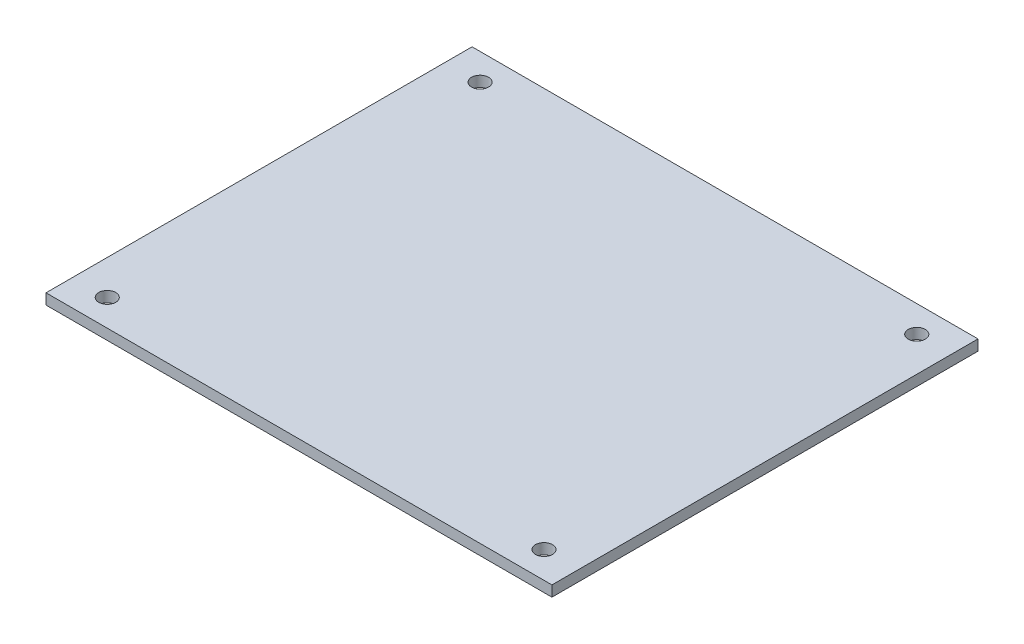
ISO-10303-21;
HEADER;
FILE_DESCRIPTION(('STEP AP214'),'2;1');
FILE_NAME('part.step','',(''),(''),'','','');
FILE_SCHEMA(('AUTOMOTIVE_DESIGN { 1 0 10303 214 1 1 1 1 }'));
ENDSEC;
DATA;
#1=APPLICATION_CONTEXT('core data for automotive mechanical design processes');
#2=APPLICATION_PROTOCOL_DEFINITION('international standard','automotive_design',2000,#1);
#3=PRODUCT_CONTEXT('',#1,'mechanical');
#4=PRODUCT('Part','Part','',(#3));
#5=PRODUCT_RELATED_PRODUCT_CATEGORY('part','',(#4));
#6=PRODUCT_DEFINITION_FORMATION('','',#4);
#7=PRODUCT_DEFINITION_CONTEXT('part definition',#1,'design');
#8=PRODUCT_DEFINITION('design','',#6,#7);
#9=PRODUCT_DEFINITION_SHAPE('','',#8);
#10=(LENGTH_UNIT() NAMED_UNIT(*) SI_UNIT(.MILLI.,.METRE.));
#11=(NAMED_UNIT(*) PLANE_ANGLE_UNIT() SI_UNIT($,.RADIAN.));
#12=(NAMED_UNIT(*) SI_UNIT($,.STERADIAN.) SOLID_ANGLE_UNIT());
#13=UNCERTAINTY_MEASURE_WITH_UNIT(LENGTH_MEASURE(1.E-05),#10,'distance_accuracy_value','');
#14=(GEOMETRIC_REPRESENTATION_CONTEXT(3) GLOBAL_UNCERTAINTY_ASSIGNED_CONTEXT((#13)) GLOBAL_UNIT_ASSIGNED_CONTEXT((#10,
#11,#12)) REPRESENTATION_CONTEXT('',''));
#15=CARTESIAN_POINT('',(0.,0.,0.));
#16=DIRECTION('',(0.,0.,1.));
#17=DIRECTION('',(1.,0.,0.));
#18=AXIS2_PLACEMENT_3D('',#15,#16,#17);
#19=CARTESIAN_POINT('',(0.,0.,80.));
#20=DIRECTION('',(0.,0.,1.));
#21=DIRECTION('',(1.,0.,0.));
#22=AXIS2_PLACEMENT_3D('',#19,#20,#21);
#23=PLANE('',#22);
#24=DIRECTION('',(-1.,0.,0.));
#25=VECTOR('',#24,1.);
#26=CARTESIAN_POINT('',(0.,-1.,80.));
#27=LINE('',#26,#25);
#28=CARTESIAN_POINT('',(47.5,-1.,80.));
#29=VERTEX_POINT('',#28);
#30=CARTESIAN_POINT('',(-47.5,-1.,80.));
#31=VERTEX_POINT('',#30);
#32=EDGE_CURVE('E10',#29,#31,#27,.T.);
#33=ORIENTED_EDGE('',*,*,#32,.F.);
#34=DIRECTION('',(0.,-1.,0.));
#35=VECTOR('',#34,1.);
#36=CARTESIAN_POINT('',(47.5,0.,80.));
#37=LINE('',#36,#35);
#38=CARTESIAN_POINT('',(47.5,1.,80.));
#39=VERTEX_POINT('',#38);
#40=EDGE_CURVE('E62',#39,#29,#37,.T.);
#41=ORIENTED_EDGE('',*,*,#40,.F.);
#42=DIRECTION('',(1.,0.,0.));
#43=VECTOR('',#42,1.);
#44=CARTESIAN_POINT('',(0.,1.,80.));
#45=LINE('',#44,#43);
#46=CARTESIAN_POINT('',(-47.5,1.,80.));
#47=VERTEX_POINT('',#46);
#48=EDGE_CURVE('E90',#47,#39,#45,.T.);
#49=ORIENTED_EDGE('',*,*,#48,.F.);
#50=DIRECTION('',(0.,1.,0.));
#51=VECTOR('',#50,1.);
#52=CARTESIAN_POINT('',(-47.5,0.,80.));
#53=LINE('',#52,#51);
#54=EDGE_CURVE('E24',#31,#47,#53,.T.);
#55=ORIENTED_EDGE('',*,*,#54,.F.);
#56=EDGE_LOOP('',(#33,#41,#49,#55));
#57=FACE_BOUND('',#56,.T.);
#58=ADVANCED_FACE('F16',(#57),#23,.T.);
#59=CARTESIAN_POINT('',(0.,-1.,0.));
#60=DIRECTION('',(0.,-1.,0.));
#61=DIRECTION('',(0.,0.,-1.));
#62=AXIS2_PLACEMENT_3D('',#59,#60,#61);
#63=PLANE('',#62);
#64=CARTESIAN_POINT('',(41.,-1.,75.));
#65=DIRECTION('',(0.,-1.,0.));
#66=DIRECTION('',(0.,0.,-1.));
#67=AXIS2_PLACEMENT_3D('',#64,#65,#66);
#68=CIRCLE('',#67,1.6);
#69=CARTESIAN_POINT('',(41.,-1.,73.4));
#70=VERTEX_POINT('',#69);
#71=EDGE_CURVE('E102',#70,#70,#68,.T.);
#72=ORIENTED_EDGE('',*,*,#71,.F.);
#73=EDGE_LOOP('',(#72));
#74=FACE_BOUND('',#73,.T.);
#75=CARTESIAN_POINT('',(41.,-1.,5.));
#76=DIRECTION('',(0.,-1.,0.));
#77=DIRECTION('',(0.,0.,-1.));
#78=AXIS2_PLACEMENT_3D('',#75,#76,#77);
#79=CIRCLE('',#78,1.6);
#80=CARTESIAN_POINT('',(41.,-1.,3.4));
#81=VERTEX_POINT('',#80);
#82=EDGE_CURVE('E99',#81,#81,#79,.T.);
#83=ORIENTED_EDGE('',*,*,#82,.F.);
#84=EDGE_LOOP('',(#83));
#85=FACE_BOUND('',#84,.T.);
#86=CARTESIAN_POINT('',(-41.,-1.,75.));
#87=DIRECTION('',(0.,-1.,0.));
#88=DIRECTION('',(0.,0.,-1.));
#89=AXIS2_PLACEMENT_3D('',#86,#87,#88);
#90=CIRCLE('',#89,1.6);
#91=CARTESIAN_POINT('',(-41.,-1.,73.4));
#92=VERTEX_POINT('',#91);
#93=EDGE_CURVE('E96',#92,#92,#90,.T.);
#94=ORIENTED_EDGE('',*,*,#93,.F.);
#95=EDGE_LOOP('',(#94));
#96=FACE_BOUND('',#95,.T.);
#97=CARTESIAN_POINT('',(-41.,-1.,5.));
#98=DIRECTION('',(0.,-1.,0.));
#99=DIRECTION('',(0.,0.,-1.));
#100=AXIS2_PLACEMENT_3D('',#97,#98,#99);
#101=CIRCLE('',#100,1.6);
#102=CARTESIAN_POINT('',(-41.,-1.,3.4));
#103=VERTEX_POINT('',#102);
#104=EDGE_CURVE('E73',#103,#103,#101,.T.);
#105=ORIENTED_EDGE('',*,*,#104,.F.);
#106=EDGE_LOOP('',(#105));
#107=FACE_BOUND('',#106,.T.);
#108=DIRECTION('',(0.,0.,1.));
#109=VECTOR('',#108,1.);
#110=CARTESIAN_POINT('',(47.5,-1.,0.));
#111=LINE('',#110,#109);
#112=CARTESIAN_POINT('',(47.5,-1.,0.));
#113=VERTEX_POINT('',#112);
#114=EDGE_CURVE('E55',#113,#29,#111,.T.);
#115=ORIENTED_EDGE('',*,*,#114,.T.);
#116=ORIENTED_EDGE('',*,*,#32,.T.);
#117=DIRECTION('',(0.,0.,1.));
#118=VECTOR('',#117,1.);
#119=CARTESIAN_POINT('',(-47.5,-1.,0.));
#120=LINE('',#119,#118);
#121=CARTESIAN_POINT('',(-47.5,-1.,0.));
#122=VERTEX_POINT('',#121);
#123=EDGE_CURVE('E68',#122,#31,#120,.T.);
#124=ORIENTED_EDGE('',*,*,#123,.F.);
#125=DIRECTION('',(1.,0.,0.));
#126=VECTOR('',#125,1.);
#127=CARTESIAN_POINT('',(0.,-1.,0.));
#128=LINE('',#127,#126);
#129=EDGE_CURVE('E66',#122,#113,#128,.T.);
#130=ORIENTED_EDGE('',*,*,#129,.T.);
#131=EDGE_LOOP('',(#115,#116,#124,#130));
#132=FACE_BOUND('',#131,.T.);
#133=ADVANCED_FACE('F67',(#74,#85,#96,#107,#132),#63,.T.);
#134=CARTESIAN_POINT('',(-47.5,0.,0.));
#135=DIRECTION('',(-1.,0.,0.));
#136=DIRECTION('',(0.,0.,1.));
#137=AXIS2_PLACEMENT_3D('',#134,#135,#136);
#138=PLANE('',#137);
#139=ORIENTED_EDGE('',*,*,#123,.T.);
#140=ORIENTED_EDGE('',*,*,#54,.T.);
#141=DIRECTION('',(0.,0.,1.));
#142=VECTOR('',#141,1.);
#143=CARTESIAN_POINT('',(-47.5,1.,0.));
#144=LINE('',#143,#142);
#145=CARTESIAN_POINT('',(-47.5,1.,0.));
#146=VERTEX_POINT('',#145);
#147=EDGE_CURVE('E85',#146,#47,#144,.T.);
#148=ORIENTED_EDGE('',*,*,#147,.F.);
#149=DIRECTION('',(0.,-1.,0.));
#150=VECTOR('',#149,1.);
#151=CARTESIAN_POINT('',(-47.5,0.,0.));
#152=LINE('',#151,#150);
#153=EDGE_CURVE('E72',#146,#122,#152,.T.);
#154=ORIENTED_EDGE('',*,*,#153,.T.);
#155=EDGE_LOOP('',(#139,#140,#148,#154));
#156=FACE_BOUND('',#155,.T.);
#157=ADVANCED_FACE('F121',(#156),#138,.T.);
#158=CARTESIAN_POINT('',(0.,1.,0.));
#159=DIRECTION('',(0.,1.,0.));
#160=DIRECTION('',(0.,0.,1.));
#161=AXIS2_PLACEMENT_3D('',#158,#159,#160);
#162=PLANE('',#161);
#163=CARTESIAN_POINT('',(41.,1.,75.));
#164=DIRECTION('',(0.,1.,0.));
#165=DIRECTION('',(0.,0.,1.));
#166=AXIS2_PLACEMENT_3D('',#163,#164,#165);
#167=CIRCLE('',#166,1.6);
#168=CARTESIAN_POINT('',(41.,1.,76.6));
#169=VERTEX_POINT('',#168);
#170=EDGE_CURVE('E19',#169,#169,#167,.T.);
#171=ORIENTED_EDGE('',*,*,#170,.F.);
#172=EDGE_LOOP('',(#171));
#173=FACE_BOUND('',#172,.T.);
#174=CARTESIAN_POINT('',(41.,1.,5.));
#175=DIRECTION('',(0.,1.,0.));
#176=DIRECTION('',(0.,0.,1.));
#177=AXIS2_PLACEMENT_3D('',#174,#175,#176);
#178=CIRCLE('',#177,1.6);
#179=CARTESIAN_POINT('',(41.,1.,6.6));
#180=VERTEX_POINT('',#179);
#181=EDGE_CURVE('E100',#180,#180,#178,.T.);
#182=ORIENTED_EDGE('',*,*,#181,.F.);
#183=EDGE_LOOP('',(#182));
#184=FACE_BOUND('',#183,.T.);
#185=CARTESIAN_POINT('',(-41.,1.,75.));
#186=DIRECTION('',(0.,1.,0.));
#187=DIRECTION('',(0.,0.,1.));
#188=AXIS2_PLACEMENT_3D('',#185,#186,#187);
#189=CIRCLE('',#188,1.6);
#190=CARTESIAN_POINT('',(-41.,1.,76.6));
#191=VERTEX_POINT('',#190);
#192=EDGE_CURVE('E97',#191,#191,#189,.T.);
#193=ORIENTED_EDGE('',*,*,#192,.F.);
#194=EDGE_LOOP('',(#193));
#195=FACE_BOUND('',#194,.T.);
#196=CARTESIAN_POINT('',(-41.,1.,5.));
#197=DIRECTION('',(0.,1.,0.));
#198=DIRECTION('',(0.,0.,1.));
#199=AXIS2_PLACEMENT_3D('',#196,#197,#198);
#200=CIRCLE('',#199,1.6);
#201=CARTESIAN_POINT('',(-41.,1.,6.6));
#202=VERTEX_POINT('',#201);
#203=EDGE_CURVE('E93',#202,#202,#200,.T.);
#204=ORIENTED_EDGE('',*,*,#203,.F.);
#205=EDGE_LOOP('',(#204));
#206=FACE_BOUND('',#205,.T.);
#207=ORIENTED_EDGE('',*,*,#147,.T.);
#208=ORIENTED_EDGE('',*,*,#48,.T.);
#209=DIRECTION('',(0.,0.,1.));
#210=VECTOR('',#209,1.);
#211=CARTESIAN_POINT('',(47.5,1.,0.));
#212=LINE('',#211,#210);
#213=CARTESIAN_POINT('',(47.5,1.,0.));
#214=VERTEX_POINT('',#213);
#215=EDGE_CURVE('E63',#214,#39,#212,.T.);
#216=ORIENTED_EDGE('',*,*,#215,.F.);
#217=DIRECTION('',(-1.,0.,0.));
#218=VECTOR('',#217,1.);
#219=CARTESIAN_POINT('',(0.,1.,0.));
#220=LINE('',#219,#218);
#221=EDGE_CURVE('E78',#214,#146,#220,.T.);
#222=ORIENTED_EDGE('',*,*,#221,.T.);
#223=EDGE_LOOP('',(#207,#208,#216,#222));
#224=FACE_BOUND('',#223,.T.);
#225=ADVANCED_FACE('F128',(#173,#184,#195,#206,#224),#162,.T.);
#226=CARTESIAN_POINT('',(0.,0.,0.));
#227=DIRECTION('',(0.,0.,-1.));
#228=DIRECTION('',(-1.,0.,0.));
#229=AXIS2_PLACEMENT_3D('',#226,#227,#228);
#230=PLANE('',#229);
#231=DIRECTION('',(0.,1.,0.));
#232=VECTOR('',#231,1.);
#233=CARTESIAN_POINT('',(47.5,0.,0.));
#234=LINE('',#233,#232);
#235=EDGE_CURVE('E60',#113,#214,#234,.T.);
#236=ORIENTED_EDGE('',*,*,#235,.F.);
#237=ORIENTED_EDGE('',*,*,#129,.F.);
#238=ORIENTED_EDGE('',*,*,#153,.F.);
#239=ORIENTED_EDGE('',*,*,#221,.F.);
#240=EDGE_LOOP('',(#236,#237,#238,#239));
#241=FACE_BOUND('',#240,.T.);
#242=ADVANCED_FACE('F76',(#241),#230,.T.);
#243=CARTESIAN_POINT('',(47.5,0.,0.));
#244=DIRECTION('',(1.,0.,0.));
#245=DIRECTION('',(0.,0.,-1.));
#246=AXIS2_PLACEMENT_3D('',#243,#244,#245);
#247=PLANE('',#246);
#248=ORIENTED_EDGE('',*,*,#235,.T.);
#249=ORIENTED_EDGE('',*,*,#215,.T.);
#250=ORIENTED_EDGE('',*,*,#40,.T.);
#251=ORIENTED_EDGE('',*,*,#114,.F.);
#252=EDGE_LOOP('',(#248,#249,#250,#251));
#253=FACE_BOUND('',#252,.T.);
#254=ADVANCED_FACE('F57',(#253),#247,.T.);
#255=CARTESIAN_POINT('',(-41.,-1.4,5.));
#256=DIRECTION('',(0.,1.,0.));
#257=DIRECTION('',(0.,0.,1.));
#258=AXIS2_PLACEMENT_3D('',#255,#256,#257);
#259=CYLINDRICAL_SURFACE('',#258,1.6);
#260=ORIENTED_EDGE('',*,*,#104,.T.);
#261=EDGE_LOOP('',(#260));
#262=FACE_BOUND('',#261,.T.);
#263=ORIENTED_EDGE('',*,*,#203,.T.);
#264=EDGE_LOOP('',(#263));
#265=FACE_BOUND('',#264,.T.);
#266=ADVANCED_FACE('F117',(#262,#265),#259,.F.);
#267=CARTESIAN_POINT('',(-41.,-1.4,75.));
#268=DIRECTION('',(0.,1.,0.));
#269=DIRECTION('',(0.,0.,1.));
#270=AXIS2_PLACEMENT_3D('',#267,#268,#269);
#271=CYLINDRICAL_SURFACE('',#270,1.6);
#272=ORIENTED_EDGE('',*,*,#93,.T.);
#273=EDGE_LOOP('',(#272));
#274=FACE_BOUND('',#273,.T.);
#275=ORIENTED_EDGE('',*,*,#192,.T.);
#276=EDGE_LOOP('',(#275));
#277=FACE_BOUND('',#276,.T.);
#278=ADVANCED_FACE('F142',(#274,#277),#271,.F.);
#279=CARTESIAN_POINT('',(41.,-1.4,5.));
#280=DIRECTION('',(0.,1.,0.));
#281=DIRECTION('',(0.,0.,1.));
#282=AXIS2_PLACEMENT_3D('',#279,#280,#281);
#283=CYLINDRICAL_SURFACE('',#282,1.6);
#284=ORIENTED_EDGE('',*,*,#82,.T.);
#285=EDGE_LOOP('',(#284));
#286=FACE_BOUND('',#285,.T.);
#287=ORIENTED_EDGE('',*,*,#181,.T.);
#288=EDGE_LOOP('',(#287));
#289=FACE_BOUND('',#288,.T.);
#290=ADVANCED_FACE('F145',(#286,#289),#283,.F.);
#291=CARTESIAN_POINT('',(41.,-1.4,75.));
#292=DIRECTION('',(0.,1.,0.));
#293=DIRECTION('',(0.,0.,1.));
#294=AXIS2_PLACEMENT_3D('',#291,#292,#293);
#295=CYLINDRICAL_SURFACE('',#294,1.6);
#296=ORIENTED_EDGE('',*,*,#71,.T.);
#297=EDGE_LOOP('',(#296));
#298=FACE_BOUND('',#297,.T.);
#299=ORIENTED_EDGE('',*,*,#170,.T.);
#300=EDGE_LOOP('',(#299));
#301=FACE_BOUND('',#300,.T.);
#302=ADVANCED_FACE('F149',(#298,#301),#295,.F.);
#303=CLOSED_SHELL('',(#58,#133,#157,#225,#242,#254,#266,#278,#290,#302));
#304=MANIFOLD_SOLID_BREP('B1',#303);
#305=ADVANCED_BREP_SHAPE_REPRESENTATION('',(#18,#304),#14);
#306=SHAPE_DEFINITION_REPRESENTATION(#9,#305);
ENDSEC;
END-ISO-10303-21;
